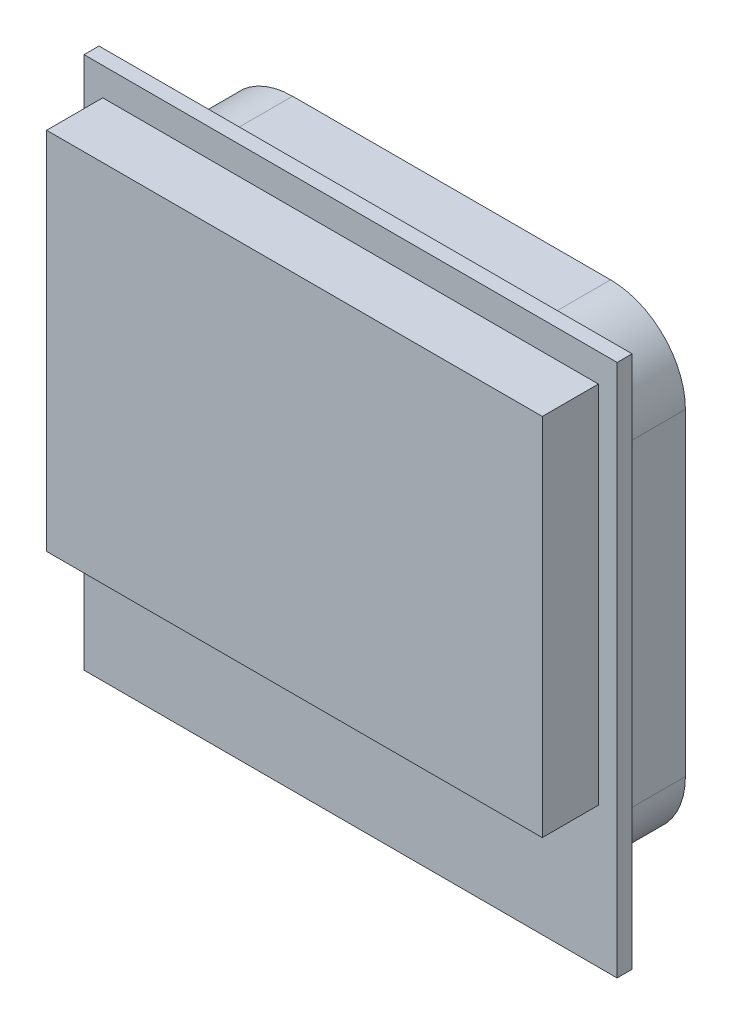
ISO-10303-21;
HEADER;
FILE_DESCRIPTION(('STEP AP214'),'2;1');
FILE_NAME('part.step','',(''),(''),'','','');
FILE_SCHEMA(('AUTOMOTIVE_DESIGN { 1 0 10303 214 1 1 1 1 }'));
ENDSEC;
DATA;
#1=APPLICATION_CONTEXT('core data for automotive mechanical design processes');
#2=APPLICATION_PROTOCOL_DEFINITION('international standard','automotive_design',2000,#1);
#3=PRODUCT_CONTEXT('',#1,'mechanical');
#4=PRODUCT('Part','Part','',(#3));
#5=PRODUCT_RELATED_PRODUCT_CATEGORY('part','',(#4));
#6=PRODUCT_DEFINITION_FORMATION('','',#4);
#7=PRODUCT_DEFINITION_CONTEXT('part definition',#1,'design');
#8=PRODUCT_DEFINITION('design','',#6,#7);
#9=PRODUCT_DEFINITION_SHAPE('','',#8);
#10=(LENGTH_UNIT() NAMED_UNIT(*) SI_UNIT(.MILLI.,.METRE.));
#11=(NAMED_UNIT(*) PLANE_ANGLE_UNIT() SI_UNIT($,.RADIAN.));
#12=(NAMED_UNIT(*) SI_UNIT($,.STERADIAN.) SOLID_ANGLE_UNIT());
#13=UNCERTAINTY_MEASURE_WITH_UNIT(LENGTH_MEASURE(1.E-05),#10,'distance_accuracy_value','');
#14=(GEOMETRIC_REPRESENTATION_CONTEXT(3) GLOBAL_UNCERTAINTY_ASSIGNED_CONTEXT((#13)) GLOBAL_UNIT_ASSIGNED_CONTEXT((#10,
#11,#12)) REPRESENTATION_CONTEXT('',''));
#15=CARTESIAN_POINT('',(0.,0.,0.));
#16=DIRECTION('',(0.,0.,1.));
#17=DIRECTION('',(1.,0.,0.));
#18=AXIS2_PLACEMENT_3D('',#15,#16,#17);
#19=CARTESIAN_POINT('',(0.,0.,0.));
#20=DIRECTION('',(0.,0.,-1.));
#21=DIRECTION('',(-1.,0.,0.));
#22=AXIS2_PLACEMENT_3D('',#19,#20,#21);
#23=PLANE('',#22);
#24=DIRECTION('',(0.,1.,0.));
#25=VECTOR('',#24,1.);
#26=CARTESIAN_POINT('',(-14.25,-14.25,0.));
#27=LINE('',#26,#25);
#28=CARTESIAN_POINT('',(-14.25,-14.25,0.));
#29=VERTEX_POINT('',#28);
#30=CARTESIAN_POINT('',(-14.25,14.25,0.));
#31=VERTEX_POINT('',#30);
#32=EDGE_CURVE('E291',#29,#31,#27,.T.);
#33=ORIENTED_EDGE('',*,*,#32,.T.);
#34=DIRECTION('',(1.,0.,0.));
#35=VECTOR('',#34,1.);
#36=CARTESIAN_POINT('',(-14.25,14.25,0.));
#37=LINE('',#36,#35);
#38=CARTESIAN_POINT('',(14.25,14.25,0.));
#39=VERTEX_POINT('',#38);
#40=EDGE_CURVE('E310',#31,#39,#37,.T.);
#41=ORIENTED_EDGE('',*,*,#40,.T.);
#42=DIRECTION('',(0.,1.,0.));
#43=VECTOR('',#42,1.);
#44=CARTESIAN_POINT('',(14.25,-14.25,0.));
#45=LINE('',#44,#43);
#46=CARTESIAN_POINT('',(14.25,-14.25,0.));
#47=VERTEX_POINT('',#46);
#48=EDGE_CURVE('E314',#47,#39,#45,.T.);
#49=ORIENTED_EDGE('',*,*,#48,.F.);
#50=DIRECTION('',(1.,0.,0.));
#51=VECTOR('',#50,1.);
#52=CARTESIAN_POINT('',(-14.25,-14.25,0.));
#53=LINE('',#52,#51);
#54=EDGE_CURVE('E297',#29,#47,#53,.T.);
#55=ORIENTED_EDGE('',*,*,#54,.F.);
#56=EDGE_LOOP('',(#33,#41,#49,#55));
#57=FACE_BOUND('',#56,.T.);
#58=DIRECTION('',(1.,0.,0.));
#59=VECTOR('',#58,1.);
#60=CARTESIAN_POINT('',(-8.49999999999997,-12.5,0.));
#61=LINE('',#60,#59);
#62=CARTESIAN_POINT('',(-8.49999999999997,-12.5,0.));
#63=VERTEX_POINT('',#62);
#64=CARTESIAN_POINT('',(8.49999999999997,-12.5,0.));
#65=VERTEX_POINT('',#64);
#66=EDGE_CURVE('E180',#63,#65,#61,.T.);
#67=ORIENTED_EDGE('',*,*,#66,.T.);
#68=CARTESIAN_POINT('',(8.5,-8.5,0.));
#69=DIRECTION('',(0.,0.,1.));
#70=DIRECTION('',(1.,0.,0.));
#71=AXIS2_PLACEMENT_3D('',#68,#69,#70);
#72=CIRCLE('',#71,4.);
#73=CARTESIAN_POINT('',(12.5,-8.49999999999997,0.));
#74=VERTEX_POINT('',#73);
#75=EDGE_CURVE('E57',#65,#74,#72,.T.);
#76=ORIENTED_EDGE('',*,*,#75,.T.);
#77=DIRECTION('',(0.,1.,0.));
#78=VECTOR('',#77,1.);
#79=CARTESIAN_POINT('',(12.5,-8.49999999999997,0.));
#80=LINE('',#79,#78);
#81=CARTESIAN_POINT('',(12.5,8.49999999999997,0.));
#82=VERTEX_POINT('',#81);
#83=EDGE_CURVE('E159',#74,#82,#80,.T.);
#84=ORIENTED_EDGE('',*,*,#83,.T.);
#85=CARTESIAN_POINT('',(8.5,8.5,0.));
#86=DIRECTION('',(0.,0.,1.));
#87=DIRECTION('',(1.,0.,0.));
#88=AXIS2_PLACEMENT_3D('',#85,#86,#87);
#89=CIRCLE('',#88,4.);
#90=CARTESIAN_POINT('',(8.49999999999997,12.5,0.));
#91=VERTEX_POINT('',#90);
#92=EDGE_CURVE('E211',#82,#91,#89,.T.);
#93=ORIENTED_EDGE('',*,*,#92,.T.);
#94=DIRECTION('',(-1.,0.,0.));
#95=VECTOR('',#94,1.);
#96=CARTESIAN_POINT('',(-8.49999999999997,12.5,0.));
#97=LINE('',#96,#95);
#98=CARTESIAN_POINT('',(-8.49999999999997,12.5,0.));
#99=VERTEX_POINT('',#98);
#100=EDGE_CURVE('E215',#91,#99,#97,.T.);
#101=ORIENTED_EDGE('',*,*,#100,.T.);
#102=CARTESIAN_POINT('',(-8.5,8.5,0.));
#103=DIRECTION('',(0.,0.,1.));
#104=DIRECTION('',(-1.,0.,0.));
#105=AXIS2_PLACEMENT_3D('',#102,#103,#104);
#106=CIRCLE('',#105,4.);
#107=CARTESIAN_POINT('',(-12.5,8.49999999999997,0.));
#108=VERTEX_POINT('',#107);
#109=EDGE_CURVE('E219',#99,#108,#106,.T.);
#110=ORIENTED_EDGE('',*,*,#109,.T.);
#111=DIRECTION('',(0.,-1.,0.));
#112=VECTOR('',#111,1.);
#113=CARTESIAN_POINT('',(-12.5,-8.49999999999997,0.));
#114=LINE('',#113,#112);
#115=CARTESIAN_POINT('',(-12.5,-8.5,0.));
#116=VERTEX_POINT('',#115);
#117=EDGE_CURVE('E223',#108,#116,#114,.T.);
#118=ORIENTED_EDGE('',*,*,#117,.T.);
#119=CARTESIAN_POINT('',(-8.5,-8.5,0.));
#120=DIRECTION('',(0.,0.,1.));
#121=DIRECTION('',(-1.,0.,0.));
#122=AXIS2_PLACEMENT_3D('',#119,#120,#121);
#123=CIRCLE('',#122,4.);
#124=EDGE_CURVE('E184',#116,#63,#123,.T.);
#125=ORIENTED_EDGE('',*,*,#124,.T.);
#126=EDGE_LOOP('',(#67,#76,#84,#93,#101,#110,#118,#125));
#127=FACE_BOUND('',#126,.T.);
#128=ADVANCED_FACE('F39',(#57,#127),#23,.T.);
#129=CARTESIAN_POINT('',(0.,0.,0.8));
#130=DIRECTION('',(0.,0.,-1.));
#131=DIRECTION('',(-1.,0.,0.));
#132=AXIS2_PLACEMENT_3D('',#129,#130,#131);
#133=PLANE('',#132);
#134=DIRECTION('',(0.,1.,0.));
#135=VECTOR('',#134,1.);
#136=CARTESIAN_POINT('',(-14.25,-14.25,0.8));
#137=LINE('',#136,#135);
#138=CARTESIAN_POINT('',(-14.25,-14.25,0.8));
#139=VERTEX_POINT('',#138);
#140=CARTESIAN_POINT('',(-14.25,14.25,0.8));
#141=VERTEX_POINT('',#140);
#142=EDGE_CURVE('E292',#139,#141,#137,.T.);
#143=ORIENTED_EDGE('',*,*,#142,.F.);
#144=DIRECTION('',(1.,0.,0.));
#145=VECTOR('',#144,1.);
#146=CARTESIAN_POINT('',(-14.25,-14.25,0.8));
#147=LINE('',#146,#145);
#148=CARTESIAN_POINT('',(14.25,-14.25,0.8));
#149=VERTEX_POINT('',#148);
#150=EDGE_CURVE('E304',#139,#149,#147,.T.);
#151=ORIENTED_EDGE('',*,*,#150,.T.);
#152=DIRECTION('',(0.,1.,0.));
#153=VECTOR('',#152,1.);
#154=CARTESIAN_POINT('',(14.25,-14.25,0.8));
#155=LINE('',#154,#153);
#156=CARTESIAN_POINT('',(14.25,14.25,0.8));
#157=VERTEX_POINT('',#156);
#158=EDGE_CURVE('E301',#149,#157,#155,.T.);
#159=ORIENTED_EDGE('',*,*,#158,.T.);
#160=DIRECTION('',(1.,0.,0.));
#161=VECTOR('',#160,1.);
#162=CARTESIAN_POINT('',(-14.25,14.25,0.8));
#163=LINE('',#162,#161);
#164=EDGE_CURVE('E296',#141,#157,#163,.T.);
#165=ORIENTED_EDGE('',*,*,#164,.F.);
#166=EDGE_LOOP('',(#143,#151,#159,#165));
#167=FACE_BOUND('',#166,.T.);
#168=DIRECTION('',(0.,-1.,0.));
#169=VECTOR('',#168,1.);
#170=CARTESIAN_POINT('',(-13.25,12.75,0.8));
#171=LINE('',#170,#169);
#172=CARTESIAN_POINT('',(-13.25,12.75,0.8));
#173=VERTEX_POINT('',#172);
#174=CARTESIAN_POINT('',(-13.25,-6.75,0.8));
#175=VERTEX_POINT('',#174);
#176=EDGE_CURVE('E65',#173,#175,#171,.T.);
#177=ORIENTED_EDGE('',*,*,#176,.F.);
#178=DIRECTION('',(1.,0.,0.));
#179=VECTOR('',#178,1.);
#180=CARTESIAN_POINT('',(-13.25,12.75,0.8));
#181=LINE('',#180,#179);
#182=CARTESIAN_POINT('',(13.25,12.75,0.8));
#183=VERTEX_POINT('',#182);
#184=EDGE_CURVE('E254',#173,#183,#181,.T.);
#185=ORIENTED_EDGE('',*,*,#184,.T.);
#186=DIRECTION('',(0.,-1.,0.));
#187=VECTOR('',#186,1.);
#188=CARTESIAN_POINT('',(13.25,12.75,0.8));
#189=LINE('',#188,#187);
#190=CARTESIAN_POINT('',(13.25,-6.75,0.8));
#191=VERTEX_POINT('',#190);
#192=EDGE_CURVE('E272',#183,#191,#189,.T.);
#193=ORIENTED_EDGE('',*,*,#192,.T.);
#194=DIRECTION('',(1.,0.,0.));
#195=VECTOR('',#194,1.);
#196=CARTESIAN_POINT('',(-13.25,-6.75,0.8));
#197=LINE('',#196,#195);
#198=EDGE_CURVE('E268',#175,#191,#197,.T.);
#199=ORIENTED_EDGE('',*,*,#198,.F.);
#200=EDGE_LOOP('',(#177,#185,#193,#199));
#201=FACE_BOUND('',#200,.T.);
#202=ADVANCED_FACE('F345',(#167,#201),#133,.F.);
#203=CARTESIAN_POINT('',(-14.25,-14.25,0.8));
#204=DIRECTION('',(-1.,0.,0.));
#205=DIRECTION('',(0.,0.,1.));
#206=AXIS2_PLACEMENT_3D('',#203,#204,#205);
#207=PLANE('',#206);
#208=ORIENTED_EDGE('',*,*,#32,.F.);
#209=DIRECTION('',(0.,0.,-1.));
#210=VECTOR('',#209,1.);
#211=CARTESIAN_POINT('',(-14.25,-14.25,0.8));
#212=LINE('',#211,#210);
#213=EDGE_CURVE('E11',#139,#29,#212,.T.);
#214=ORIENTED_EDGE('',*,*,#213,.F.);
#215=ORIENTED_EDGE('',*,*,#142,.T.);
#216=DIRECTION('',(0.,0.,-1.));
#217=VECTOR('',#216,1.);
#218=CARTESIAN_POINT('',(-14.25,14.25,0.8));
#219=LINE('',#218,#217);
#220=EDGE_CURVE('E43',#141,#31,#219,.T.);
#221=ORIENTED_EDGE('',*,*,#220,.T.);
#222=EDGE_LOOP('',(#208,#214,#215,#221));
#223=FACE_BOUND('',#222,.T.);
#224=ADVANCED_FACE('F41',(#223),#207,.T.);
#225=CARTESIAN_POINT('',(-14.25,-14.25,0.8));
#226=DIRECTION('',(0.,1.,0.));
#227=DIRECTION('',(0.,0.,1.));
#228=AXIS2_PLACEMENT_3D('',#225,#226,#227);
#229=PLANE('',#228);
#230=ORIENTED_EDGE('',*,*,#54,.T.);
#231=DIRECTION('',(0.,0.,-1.));
#232=VECTOR('',#231,1.);
#233=CARTESIAN_POINT('',(14.25,-14.25,0.8));
#234=LINE('',#233,#232);
#235=EDGE_CURVE('E49',#149,#47,#234,.T.);
#236=ORIENTED_EDGE('',*,*,#235,.F.);
#237=ORIENTED_EDGE('',*,*,#150,.F.);
#238=ORIENTED_EDGE('',*,*,#213,.T.);
#239=EDGE_LOOP('',(#230,#236,#237,#238));
#240=FACE_BOUND('',#239,.T.);
#241=ADVANCED_FACE('F339',(#240),#229,.F.);
#242=CARTESIAN_POINT('',(14.25,-14.25,0.8));
#243=DIRECTION('',(-1.,0.,0.));
#244=DIRECTION('',(0.,0.,1.));
#245=AXIS2_PLACEMENT_3D('',#242,#243,#244);
#246=PLANE('',#245);
#247=ORIENTED_EDGE('',*,*,#48,.T.);
#248=DIRECTION('',(0.,0.,-1.));
#249=VECTOR('',#248,1.);
#250=CARTESIAN_POINT('',(14.25,14.25,0.8));
#251=LINE('',#250,#249);
#252=EDGE_CURVE('E322',#157,#39,#251,.T.);
#253=ORIENTED_EDGE('',*,*,#252,.F.);
#254=ORIENTED_EDGE('',*,*,#158,.F.);
#255=ORIENTED_EDGE('',*,*,#235,.T.);
#256=EDGE_LOOP('',(#247,#253,#254,#255));
#257=FACE_BOUND('',#256,.T.);
#258=ADVANCED_FACE('F343',(#257),#246,.F.);
#259=CARTESIAN_POINT('',(-14.25,14.25,0.8));
#260=DIRECTION('',(0.,1.,0.));
#261=DIRECTION('',(0.,0.,1.));
#262=AXIS2_PLACEMENT_3D('',#259,#260,#261);
#263=PLANE('',#262);
#264=ORIENTED_EDGE('',*,*,#40,.F.);
#265=ORIENTED_EDGE('',*,*,#220,.F.);
#266=ORIENTED_EDGE('',*,*,#164,.T.);
#267=ORIENTED_EDGE('',*,*,#252,.T.);
#268=EDGE_LOOP('',(#264,#265,#266,#267));
#269=FACE_BOUND('',#268,.T.);
#270=ADVANCED_FACE('F332',(#269),#263,.T.);
#271=CARTESIAN_POINT('',(-13.25,12.75,3.8));
#272=DIRECTION('',(1.,0.,0.));
#273=DIRECTION('',(0.,1.,0.));
#274=AXIS2_PLACEMENT_3D('',#271,#272,#273);
#275=PLANE('',#274);
#276=ORIENTED_EDGE('',*,*,#176,.T.);
#277=DIRECTION('',(0.,0.,-1.));
#278=VECTOR('',#277,1.);
#279=CARTESIAN_POINT('',(-13.25,-6.75,3.8));
#280=LINE('',#279,#278);
#281=CARTESIAN_POINT('',(-13.25,-6.75,3.8));
#282=VERTEX_POINT('',#281);
#283=EDGE_CURVE('E287',#282,#175,#280,.T.);
#284=ORIENTED_EDGE('',*,*,#283,.F.);
#285=DIRECTION('',(0.,-1.,0.));
#286=VECTOR('',#285,1.);
#287=CARTESIAN_POINT('',(-13.25,12.75,3.8));
#288=LINE('',#287,#286);
#289=CARTESIAN_POINT('',(-13.25,12.75,3.8));
#290=VERTEX_POINT('',#289);
#291=EDGE_CURVE('E249',#290,#282,#288,.T.);
#292=ORIENTED_EDGE('',*,*,#291,.F.);
#293=DIRECTION('',(0.,0.,-1.));
#294=VECTOR('',#293,1.);
#295=CARTESIAN_POINT('',(-13.25,12.75,3.8));
#296=LINE('',#295,#294);
#297=EDGE_CURVE('E265',#290,#173,#296,.T.);
#298=ORIENTED_EDGE('',*,*,#297,.T.);
#299=EDGE_LOOP('',(#276,#284,#292,#298));
#300=FACE_BOUND('',#299,.T.);
#301=ADVANCED_FACE('F354',(#300),#275,.F.);
#302=CARTESIAN_POINT('',(-13.25,-6.75,3.8));
#303=DIRECTION('',(0.,1.,0.));
#304=DIRECTION('',(-1.,0.,0.));
#305=AXIS2_PLACEMENT_3D('',#302,#303,#304);
#306=PLANE('',#305);
#307=ORIENTED_EDGE('',*,*,#198,.T.);
#308=DIRECTION('',(0.,0.,-1.));
#309=VECTOR('',#308,1.);
#310=CARTESIAN_POINT('',(13.25,-6.75,3.8));
#311=LINE('',#310,#309);
#312=CARTESIAN_POINT('',(13.25,-6.75,3.8));
#313=VERTEX_POINT('',#312);
#314=EDGE_CURVE('E283',#313,#191,#311,.T.);
#315=ORIENTED_EDGE('',*,*,#314,.F.);
#316=DIRECTION('',(1.,0.,0.));
#317=VECTOR('',#316,1.);
#318=CARTESIAN_POINT('',(-13.25,-6.75,3.8));
#319=LINE('',#318,#317);
#320=EDGE_CURVE('E253',#282,#313,#319,.T.);
#321=ORIENTED_EDGE('',*,*,#320,.F.);
#322=ORIENTED_EDGE('',*,*,#283,.T.);
#323=EDGE_LOOP('',(#307,#315,#321,#322));
#324=FACE_BOUND('',#323,.T.);
#325=ADVANCED_FACE('F364',(#324),#306,.F.);
#326=CARTESIAN_POINT('',(13.25,12.75,3.8));
#327=DIRECTION('',(1.,0.,0.));
#328=DIRECTION('',(0.,1.,0.));
#329=AXIS2_PLACEMENT_3D('',#326,#327,#328);
#330=PLANE('',#329);
#331=ORIENTED_EDGE('',*,*,#192,.F.);
#332=DIRECTION('',(0.,0.,-1.));
#333=VECTOR('',#332,1.);
#334=CARTESIAN_POINT('',(13.25,12.75,3.8));
#335=LINE('',#334,#333);
#336=CARTESIAN_POINT('',(13.25,12.75,3.8));
#337=VERTEX_POINT('',#336);
#338=EDGE_CURVE('E279',#337,#183,#335,.T.);
#339=ORIENTED_EDGE('',*,*,#338,.F.);
#340=DIRECTION('',(0.,-1.,0.));
#341=VECTOR('',#340,1.);
#342=CARTESIAN_POINT('',(13.25,12.75,3.8));
#343=LINE('',#342,#341);
#344=EDGE_CURVE('E257',#337,#313,#343,.T.);
#345=ORIENTED_EDGE('',*,*,#344,.T.);
#346=ORIENTED_EDGE('',*,*,#314,.T.);
#347=EDGE_LOOP('',(#331,#339,#345,#346));
#348=FACE_BOUND('',#347,.T.);
#349=ADVANCED_FACE('F369',(#348),#330,.T.);
#350=CARTESIAN_POINT('',(-13.25,12.75,3.8));
#351=DIRECTION('',(0.,1.,0.));
#352=DIRECTION('',(-1.,0.,0.));
#353=AXIS2_PLACEMENT_3D('',#350,#351,#352);
#354=PLANE('',#353);
#355=ORIENTED_EDGE('',*,*,#184,.F.);
#356=ORIENTED_EDGE('',*,*,#297,.F.);
#357=DIRECTION('',(1.,0.,0.));
#358=VECTOR('',#357,1.);
#359=CARTESIAN_POINT('',(-13.25,12.75,3.8));
#360=LINE('',#359,#358);
#361=EDGE_CURVE('E261',#290,#337,#360,.T.);
#362=ORIENTED_EDGE('',*,*,#361,.T.);
#363=ORIENTED_EDGE('',*,*,#338,.T.);
#364=EDGE_LOOP('',(#355,#356,#362,#363));
#365=FACE_BOUND('',#364,.T.);
#366=ADVANCED_FACE('F376',(#365),#354,.T.);
#367=CARTESIAN_POINT('',(0.,0.,3.8));
#368=DIRECTION('',(0.,0.,1.));
#369=DIRECTION('',(1.,0.,0.));
#370=AXIS2_PLACEMENT_3D('',#367,#368,#369);
#371=PLANE('',#370);
#372=ORIENTED_EDGE('',*,*,#291,.T.);
#373=ORIENTED_EDGE('',*,*,#320,.T.);
#374=ORIENTED_EDGE('',*,*,#344,.F.);
#375=ORIENTED_EDGE('',*,*,#361,.F.);
#376=EDGE_LOOP('',(#372,#373,#374,#375));
#377=FACE_BOUND('',#376,.T.);
#378=ADVANCED_FACE('F382',(#377),#371,.T.);
#379=CARTESIAN_POINT('',(8.5,-8.5,-4.6));
#380=DIRECTION('',(0.,0.,1.));
#381=DIRECTION('',(1.,0.,0.));
#382=AXIS2_PLACEMENT_3D('',#379,#380,#381);
#383=CYLINDRICAL_SURFACE('',#382,4.);
#384=ORIENTED_EDGE('',*,*,#75,.F.);
#385=DIRECTION('',(0.,0.,1.));
#386=VECTOR('',#385,1.);
#387=CARTESIAN_POINT('',(8.49999999999997,-12.5,-4.6));
#388=LINE('',#387,#386);
#389=CARTESIAN_POINT('',(8.49999999999997,-12.5,-4.6));
#390=VERTEX_POINT('',#389);
#391=EDGE_CURVE('E178',#390,#65,#388,.T.);
#392=ORIENTED_EDGE('',*,*,#391,.F.);
#393=CARTESIAN_POINT('',(8.5,-8.5,-4.6));
#394=DIRECTION('',(0.,0.,1.));
#395=DIRECTION('',(1.,0.,0.));
#396=AXIS2_PLACEMENT_3D('',#393,#394,#395);
#397=CIRCLE('',#396,4.);
#398=CARTESIAN_POINT('',(12.5,-8.49999999999997,-4.6));
#399=VERTEX_POINT('',#398);
#400=EDGE_CURVE('E170',#390,#399,#397,.T.);
#401=ORIENTED_EDGE('',*,*,#400,.T.);
#402=DIRECTION('',(0.,0.,1.));
#403=VECTOR('',#402,1.);
#404=CARTESIAN_POINT('',(12.5,-8.49999999999997,-4.6));
#405=LINE('',#404,#403);
#406=EDGE_CURVE('E154',#399,#74,#405,.T.);
#407=ORIENTED_EDGE('',*,*,#406,.T.);
#408=EDGE_LOOP('',(#384,#392,#401,#407));
#409=FACE_BOUND('',#408,.T.);
#410=ADVANCED_FACE('F177',(#409),#383,.T.);
#411=CARTESIAN_POINT('',(-8.49999999999997,-12.5,-4.6));
#412=DIRECTION('',(0.,-1.,0.));
#413=DIRECTION('',(0.,0.,-1.));
#414=AXIS2_PLACEMENT_3D('',#411,#412,#413);
#415=PLANE('',#414);
#416=ORIENTED_EDGE('',*,*,#66,.F.);
#417=DIRECTION('',(0.,0.,1.));
#418=VECTOR('',#417,1.);
#419=CARTESIAN_POINT('',(-8.49999999999997,-12.5,-4.6));
#420=LINE('',#419,#418);
#421=CARTESIAN_POINT('',(-8.49999999999997,-12.5,-4.6));
#422=VERTEX_POINT('',#421);
#423=EDGE_CURVE('E232',#422,#63,#420,.T.);
#424=ORIENTED_EDGE('',*,*,#423,.F.);
#425=DIRECTION('',(1.,0.,0.));
#426=VECTOR('',#425,1.);
#427=CARTESIAN_POINT('',(-8.49999999999997,-12.5,-4.6));
#428=LINE('',#427,#426);
#429=EDGE_CURVE('E163',#422,#390,#428,.T.);
#430=ORIENTED_EDGE('',*,*,#429,.T.);
#431=ORIENTED_EDGE('',*,*,#391,.T.);
#432=EDGE_LOOP('',(#416,#424,#430,#431));
#433=FACE_BOUND('',#432,.T.);
#434=ADVANCED_FACE('F389',(#433),#415,.T.);
#435=CARTESIAN_POINT('',(-8.5,-8.5,-4.6));
#436=DIRECTION('',(0.,0.,1.));
#437=DIRECTION('',(1.,0.,0.));
#438=AXIS2_PLACEMENT_3D('',#435,#436,#437);
#439=CYLINDRICAL_SURFACE('',#438,4.);
#440=ORIENTED_EDGE('',*,*,#124,.F.);
#441=DIRECTION('',(0.,0.,1.));
#442=VECTOR('',#441,1.);
#443=CARTESIAN_POINT('',(-12.5,-8.5,-4.6));
#444=LINE('',#443,#442);
#445=CARTESIAN_POINT('',(-12.5,-8.5,-4.6));
#446=VERTEX_POINT('',#445);
#447=EDGE_CURVE('E235',#446,#116,#444,.T.);
#448=ORIENTED_EDGE('',*,*,#447,.F.);
#449=CARTESIAN_POINT('',(-8.5,-8.5,-4.6));
#450=DIRECTION('',(0.,0.,1.));
#451=DIRECTION('',(-1.,0.,0.));
#452=AXIS2_PLACEMENT_3D('',#449,#450,#451);
#453=CIRCLE('',#452,4.);
#454=EDGE_CURVE('E201',#446,#422,#453,.T.);
#455=ORIENTED_EDGE('',*,*,#454,.T.);
#456=ORIENTED_EDGE('',*,*,#423,.T.);
#457=EDGE_LOOP('',(#440,#448,#455,#456));
#458=FACE_BOUND('',#457,.T.);
#459=ADVANCED_FACE('F428',(#458),#439,.T.);
#460=CARTESIAN_POINT('',(-12.5,-8.49999999999997,-4.6));
#461=DIRECTION('',(-1.,0.,0.));
#462=DIRECTION('',(0.,0.,1.));
#463=AXIS2_PLACEMENT_3D('',#460,#461,#462);
#464=PLANE('',#463);
#465=ORIENTED_EDGE('',*,*,#117,.F.);
#466=DIRECTION('',(0.,0.,1.));
#467=VECTOR('',#466,1.);
#468=CARTESIAN_POINT('',(-12.5,8.49999999999997,-4.6));
#469=LINE('',#468,#467);
#470=CARTESIAN_POINT('',(-12.5,8.49999999999997,-4.6));
#471=VERTEX_POINT('',#470);
#472=EDGE_CURVE('E238',#471,#108,#469,.T.);
#473=ORIENTED_EDGE('',*,*,#472,.F.);
#474=DIRECTION('',(0.,-1.,0.));
#475=VECTOR('',#474,1.);
#476=CARTESIAN_POINT('',(-12.5,-8.49999999999997,-4.6));
#477=LINE('',#476,#475);
#478=EDGE_CURVE('E197',#471,#446,#477,.T.);
#479=ORIENTED_EDGE('',*,*,#478,.T.);
#480=ORIENTED_EDGE('',*,*,#447,.T.);
#481=EDGE_LOOP('',(#465,#473,#479,#480));
#482=FACE_BOUND('',#481,.T.);
#483=ADVANCED_FACE('F438',(#482),#464,.T.);
#484=CARTESIAN_POINT('',(-8.5,8.5,-4.6));
#485=DIRECTION('',(0.,0.,1.));
#486=DIRECTION('',(1.,0.,0.));
#487=AXIS2_PLACEMENT_3D('',#484,#485,#486);
#488=CYLINDRICAL_SURFACE('',#487,4.);
#489=ORIENTED_EDGE('',*,*,#109,.F.);
#490=DIRECTION('',(0.,0.,1.));
#491=VECTOR('',#490,1.);
#492=CARTESIAN_POINT('',(-8.49999999999997,12.5,-4.6));
#493=LINE('',#492,#491);
#494=CARTESIAN_POINT('',(-8.49999999999997,12.5,-4.6));
#495=VERTEX_POINT('',#494);
#496=EDGE_CURVE('E241',#495,#99,#493,.T.);
#497=ORIENTED_EDGE('',*,*,#496,.F.);
#498=CARTESIAN_POINT('',(-8.5,8.5,-4.6));
#499=DIRECTION('',(0.,0.,1.));
#500=DIRECTION('',(-1.,0.,0.));
#501=AXIS2_PLACEMENT_3D('',#498,#499,#500);
#502=CIRCLE('',#501,4.);
#503=EDGE_CURVE('E193',#495,#471,#502,.T.);
#504=ORIENTED_EDGE('',*,*,#503,.T.);
#505=ORIENTED_EDGE('',*,*,#472,.T.);
#506=EDGE_LOOP('',(#489,#497,#504,#505));
#507=FACE_BOUND('',#506,.T.);
#508=ADVANCED_FACE('F448',(#507),#488,.T.);
#509=CARTESIAN_POINT('',(-8.49999999999997,12.5,-4.6));
#510=DIRECTION('',(0.,1.,0.));
#511=DIRECTION('',(0.,0.,1.));
#512=AXIS2_PLACEMENT_3D('',#509,#510,#511);
#513=PLANE('',#512);
#514=ORIENTED_EDGE('',*,*,#100,.F.);
#515=DIRECTION('',(0.,0.,1.));
#516=VECTOR('',#515,1.);
#517=CARTESIAN_POINT('',(8.49999999999997,12.5,-4.6));
#518=LINE('',#517,#516);
#519=CARTESIAN_POINT('',(8.49999999999997,12.5,-4.6));
#520=VERTEX_POINT('',#519);
#521=EDGE_CURVE('E244',#520,#91,#518,.T.);
#522=ORIENTED_EDGE('',*,*,#521,.F.);
#523=DIRECTION('',(-1.,0.,0.));
#524=VECTOR('',#523,1.);
#525=CARTESIAN_POINT('',(-8.49999999999997,12.5,-4.6));
#526=LINE('',#525,#524);
#527=EDGE_CURVE('E189',#520,#495,#526,.T.);
#528=ORIENTED_EDGE('',*,*,#527,.T.);
#529=ORIENTED_EDGE('',*,*,#496,.T.);
#530=EDGE_LOOP('',(#514,#522,#528,#529));
#531=FACE_BOUND('',#530,.T.);
#532=ADVANCED_FACE('F458',(#531),#513,.T.);
#533=CARTESIAN_POINT('',(8.5,8.5,-4.6));
#534=DIRECTION('',(0.,0.,1.));
#535=DIRECTION('',(1.,0.,0.));
#536=AXIS2_PLACEMENT_3D('',#533,#534,#535);
#537=CYLINDRICAL_SURFACE('',#536,4.);
#538=ORIENTED_EDGE('',*,*,#92,.F.);
#539=DIRECTION('',(0.,0.,1.));
#540=VECTOR('',#539,1.);
#541=CARTESIAN_POINT('',(12.5,8.49999999999997,-4.6));
#542=LINE('',#541,#540);
#543=CARTESIAN_POINT('',(12.5,8.49999999999997,-4.6));
#544=VERTEX_POINT('',#543);
#545=EDGE_CURVE('E162',#544,#82,#542,.T.);
#546=ORIENTED_EDGE('',*,*,#545,.F.);
#547=CARTESIAN_POINT('',(8.5,8.5,-4.6));
#548=DIRECTION('',(0.,0.,1.));
#549=DIRECTION('',(1.,0.,0.));
#550=AXIS2_PLACEMENT_3D('',#547,#548,#549);
#551=CIRCLE('',#550,4.);
#552=EDGE_CURVE('E174',#544,#520,#551,.T.);
#553=ORIENTED_EDGE('',*,*,#552,.T.);
#554=ORIENTED_EDGE('',*,*,#521,.T.);
#555=EDGE_LOOP('',(#538,#546,#553,#554));
#556=FACE_BOUND('',#555,.T.);
#557=ADVANCED_FACE('F468',(#556),#537,.T.);
#558=CARTESIAN_POINT('',(12.5,-8.49999999999997,-4.6));
#559=DIRECTION('',(1.,0.,0.));
#560=DIRECTION('',(0.,0.,-1.));
#561=AXIS2_PLACEMENT_3D('',#558,#559,#560);
#562=PLANE('',#561);
#563=ORIENTED_EDGE('',*,*,#83,.F.);
#564=ORIENTED_EDGE('',*,*,#406,.F.);
#565=DIRECTION('',(0.,1.,0.));
#566=VECTOR('',#565,1.);
#567=CARTESIAN_POINT('',(12.5,-8.49999999999997,-4.6));
#568=LINE('',#567,#566);
#569=EDGE_CURVE('E157',#399,#544,#568,.T.);
#570=ORIENTED_EDGE('',*,*,#569,.T.);
#571=ORIENTED_EDGE('',*,*,#545,.T.);
#572=EDGE_LOOP('',(#563,#564,#570,#571));
#573=FACE_BOUND('',#572,.T.);
#574=ADVANCED_FACE('F156',(#573),#562,.T.);
#575=CARTESIAN_POINT('',(8.5,-8.5,-4.6));
#576=DIRECTION('',(0.,0.,1.));
#577=DIRECTION('',(1.,0.,0.));
#578=AXIS2_PLACEMENT_3D('',#575,#576,#577);
#579=PLANE('',#578);
#580=ORIENTED_EDGE('',*,*,#400,.F.);
#581=ORIENTED_EDGE('',*,*,#429,.F.);
#582=ORIENTED_EDGE('',*,*,#454,.F.);
#583=ORIENTED_EDGE('',*,*,#478,.F.);
#584=ORIENTED_EDGE('',*,*,#503,.F.);
#585=ORIENTED_EDGE('',*,*,#527,.F.);
#586=ORIENTED_EDGE('',*,*,#552,.F.);
#587=ORIENTED_EDGE('',*,*,#569,.F.);
#588=EDGE_LOOP('',(#580,#581,#582,#583,#584,#585,#586,#587));
#589=FACE_BOUND('',#588,.T.);
#590=ADVANCED_FACE('F168',(#589),#579,.F.);
#591=CLOSED_SHELL('',(#128,#202,#224,#241,#258,#270,#301,#325,#349,#366,#378,#410,#434,#459,
#483,#508,#532,#557,#574,#590));
#592=MANIFOLD_SOLID_BREP('B2',#591);
#593=ADVANCED_BREP_SHAPE_REPRESENTATION('',(#18,#592),#14);
#594=SHAPE_DEFINITION_REPRESENTATION(#9,#593);
ENDSEC;
END-ISO-10303-21;
